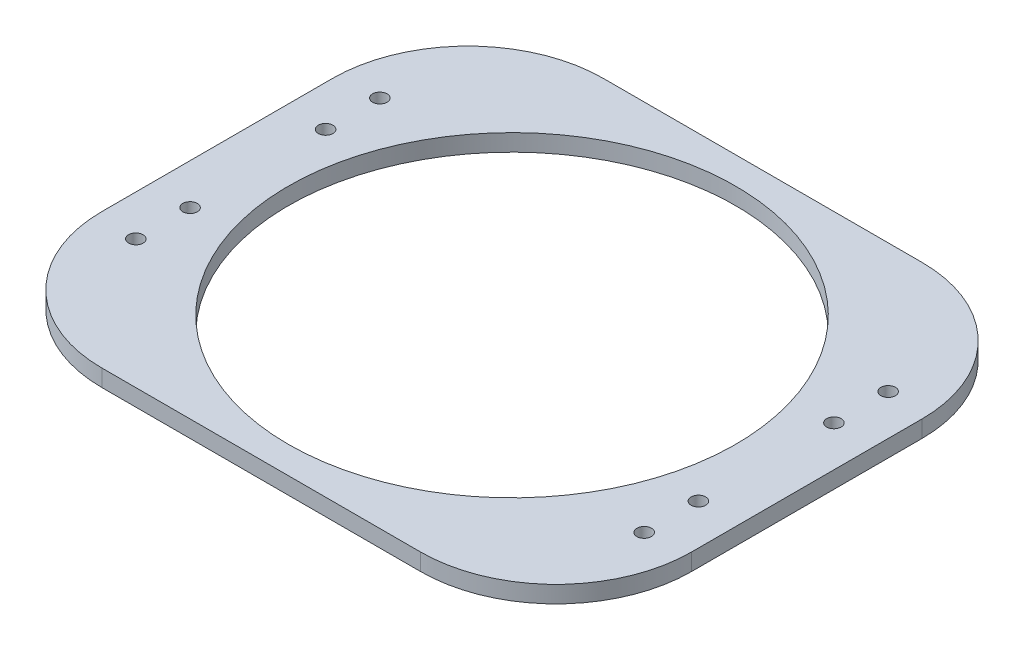
ISO-10303-21;
HEADER;
FILE_DESCRIPTION(('STEP AP214'),'2;1');
FILE_NAME('part.step','',(''),(''),'','','');
FILE_SCHEMA(('AUTOMOTIVE_DESIGN { 1 0 10303 214 1 1 1 1 }'));
ENDSEC;
DATA;
#1=APPLICATION_CONTEXT('core data for automotive mechanical design processes');
#2=APPLICATION_PROTOCOL_DEFINITION('international standard','automotive_design',2000,#1);
#3=PRODUCT_CONTEXT('',#1,'mechanical');
#4=PRODUCT('Part','Part','',(#3));
#5=PRODUCT_RELATED_PRODUCT_CATEGORY('part','',(#4));
#6=PRODUCT_DEFINITION_FORMATION('','',#4);
#7=PRODUCT_DEFINITION_CONTEXT('part definition',#1,'design');
#8=PRODUCT_DEFINITION('design','',#6,#7);
#9=PRODUCT_DEFINITION_SHAPE('','',#8);
#10=(LENGTH_UNIT() NAMED_UNIT(*) SI_UNIT(.MILLI.,.METRE.));
#11=(NAMED_UNIT(*) PLANE_ANGLE_UNIT() SI_UNIT($,.RADIAN.));
#12=(NAMED_UNIT(*) SI_UNIT($,.STERADIAN.) SOLID_ANGLE_UNIT());
#13=UNCERTAINTY_MEASURE_WITH_UNIT(LENGTH_MEASURE(1.E-05),#10,'distance_accuracy_value','');
#14=(GEOMETRIC_REPRESENTATION_CONTEXT(3) GLOBAL_UNCERTAINTY_ASSIGNED_CONTEXT((#13)) GLOBAL_UNIT_ASSIGNED_CONTEXT((#10,
#11,#12)) REPRESENTATION_CONTEXT('',''));
#15=CARTESIAN_POINT('',(0.,0.,0.));
#16=DIRECTION('',(0.,0.,1.));
#17=DIRECTION('',(1.,0.,0.));
#18=AXIS2_PLACEMENT_3D('',#15,#16,#17);
#19=CARTESIAN_POINT('',(0.,5.,0.));
#20=DIRECTION('',(0.,1.,0.));
#21=DIRECTION('',(0.,0.,1.));
#22=AXIS2_PLACEMENT_3D('',#19,#20,#21);
#23=PLANE('',#22);
#24=CARTESIAN_POINT('',(-75.,5.,-20.));
#25=DIRECTION('',(0.,1.,0.));
#26=DIRECTION('',(0.,0.,-1.));
#27=AXIS2_PLACEMENT_3D('',#24,#25,#26);
#28=CIRCLE('',#27,2.15);
#29=CARTESIAN_POINT('',(-75.,5.,-22.15));
#30=VERTEX_POINT('',#29);
#31=EDGE_CURVE('E265',#30,#30,#28,.T.);
#32=ORIENTED_EDGE('',*,*,#31,.F.);
#33=EDGE_LOOP('',(#32));
#34=FACE_BOUND('',#33,.T.);
#35=CARTESIAN_POINT('',(-75.,5.,36.));
#36=DIRECTION('',(0.,1.,0.));
#37=DIRECTION('',(0.,0.,1.));
#38=AXIS2_PLACEMENT_3D('',#35,#36,#37);
#39=CIRCLE('',#38,2.15);
#40=CARTESIAN_POINT('',(-75.,5.,38.15));
#41=VERTEX_POINT('',#40);
#42=EDGE_CURVE('E249',#41,#41,#39,.T.);
#43=ORIENTED_EDGE('',*,*,#42,.F.);
#44=EDGE_LOOP('',(#43));
#45=FACE_BOUND('',#44,.T.);
#46=CARTESIAN_POINT('',(75.,5.,20.));
#47=DIRECTION('',(0.,1.,0.));
#48=DIRECTION('',(0.,0.,-1.));
#49=AXIS2_PLACEMENT_3D('',#46,#47,#48);
#50=CIRCLE('',#49,2.15);
#51=CARTESIAN_POINT('',(75.,5.,17.85));
#52=VERTEX_POINT('',#51);
#53=EDGE_CURVE('E233',#52,#52,#50,.T.);
#54=ORIENTED_EDGE('',*,*,#53,.F.);
#55=EDGE_LOOP('',(#54));
#56=FACE_BOUND('',#55,.T.);
#57=CARTESIAN_POINT('',(75.,5.,-36.));
#58=DIRECTION('',(0.,1.,0.));
#59=DIRECTION('',(0.,0.,1.));
#60=AXIS2_PLACEMENT_3D('',#57,#58,#59);
#61=CIRCLE('',#60,2.15);
#62=CARTESIAN_POINT('',(75.,5.,-33.85));
#63=VERTEX_POINT('',#62);
#64=EDGE_CURVE('E219',#63,#63,#61,.T.);
#65=ORIENTED_EDGE('',*,*,#64,.F.);
#66=EDGE_LOOP('',(#65));
#67=FACE_BOUND('',#66,.T.);
#68=DIRECTION('',(-1.,0.,0.));
#69=VECTOR('',#68,1.);
#70=CARTESIAN_POINT('',(87.,5.,-74.));
#71=LINE('',#70,#69);
#72=CARTESIAN_POINT('',(47.,5.,-74.));
#73=VERTEX_POINT('',#72);
#74=CARTESIAN_POINT('',(-47.,5.,-74.));
#75=VERTEX_POINT('',#74);
#76=EDGE_CURVE('E154',#73,#75,#71,.T.);
#77=ORIENTED_EDGE('',*,*,#76,.T.);
#78=CARTESIAN_POINT('',(-47.,5.,-34.));
#79=DIRECTION('',(0.,1.,0.));
#80=DIRECTION('',(0.,0.,1.));
#81=AXIS2_PLACEMENT_3D('',#78,#79,#80);
#82=CIRCLE('',#81,40.);
#83=CARTESIAN_POINT('',(-87.,5.,-34.));
#84=VERTEX_POINT('',#83);
#85=EDGE_CURVE('E184',#75,#84,#82,.T.);
#86=ORIENTED_EDGE('',*,*,#85,.T.);
#87=DIRECTION('',(0.,0.,1.));
#88=VECTOR('',#87,1.);
#89=CARTESIAN_POINT('',(-87.,5.,74.));
#90=LINE('',#89,#88);
#91=CARTESIAN_POINT('',(-87.,5.,34.));
#92=VERTEX_POINT('',#91);
#93=EDGE_CURVE('E133',#84,#92,#90,.T.);
#94=ORIENTED_EDGE('',*,*,#93,.T.);
#95=CARTESIAN_POINT('',(-47.,5.,34.));
#96=DIRECTION('',(0.,1.,0.));
#97=DIRECTION('',(0.,0.,1.));
#98=AXIS2_PLACEMENT_3D('',#95,#96,#97);
#99=CIRCLE('',#98,40.);
#100=CARTESIAN_POINT('',(-47.,5.,74.));
#101=VERTEX_POINT('',#100);
#102=EDGE_CURVE('E176',#92,#101,#99,.T.);
#103=ORIENTED_EDGE('',*,*,#102,.T.);
#104=DIRECTION('',(1.,0.,0.));
#105=VECTOR('',#104,1.);
#106=CARTESIAN_POINT('',(87.,5.,74.));
#107=LINE('',#106,#105);
#108=CARTESIAN_POINT('',(47.,5.,74.));
#109=VERTEX_POINT('',#108);
#110=EDGE_CURVE('E199',#101,#109,#107,.T.);
#111=ORIENTED_EDGE('',*,*,#110,.T.);
#112=CARTESIAN_POINT('',(47.,5.,34.));
#113=DIRECTION('',(0.,1.,0.));
#114=DIRECTION('',(0.,0.,1.));
#115=AXIS2_PLACEMENT_3D('',#112,#113,#114);
#116=CIRCLE('',#115,40.);
#117=CARTESIAN_POINT('',(87.,5.,34.));
#118=VERTEX_POINT('',#117);
#119=EDGE_CURVE('E68',#109,#118,#116,.T.);
#120=ORIENTED_EDGE('',*,*,#119,.T.);
#121=DIRECTION('',(0.,0.,-1.));
#122=VECTOR('',#121,1.);
#123=CARTESIAN_POINT('',(87.,5.,74.));
#124=LINE('',#123,#122);
#125=CARTESIAN_POINT('',(87.,5.,-34.));
#126=VERTEX_POINT('',#125);
#127=EDGE_CURVE('E207',#118,#126,#124,.T.);
#128=ORIENTED_EDGE('',*,*,#127,.T.);
#129=CARTESIAN_POINT('',(47.,5.,-34.));
#130=DIRECTION('',(0.,1.,0.));
#131=DIRECTION('',(0.,0.,1.));
#132=AXIS2_PLACEMENT_3D('',#129,#130,#131);
#133=CIRCLE('',#132,40.);
#134=EDGE_CURVE('E181',#126,#73,#133,.T.);
#135=ORIENTED_EDGE('',*,*,#134,.T.);
#136=EDGE_LOOP('',(#77,#86,#94,#103,#111,#120,#128,#135));
#137=FACE_BOUND('',#136,.T.);
#138=CARTESIAN_POINT('',(0.,5.,0.));
#139=DIRECTION('',(0.,1.,0.));
#140=DIRECTION('',(0.,0.,1.));
#141=AXIS2_PLACEMENT_3D('',#138,#139,#140);
#142=CIRCLE('',#141,66.);
#143=CARTESIAN_POINT('',(0.,5.,66.));
#144=VERTEX_POINT('',#143);
#145=EDGE_CURVE('E143',#144,#144,#142,.T.);
#146=ORIENTED_EDGE('',*,*,#145,.F.);
#147=EDGE_LOOP('',(#146));
#148=FACE_BOUND('',#147,.T.);
#149=CARTESIAN_POINT('',(75.,5.,-20.));
#150=DIRECTION('',(0.,1.,0.));
#151=DIRECTION('',(0.,0.,1.));
#152=AXIS2_PLACEMENT_3D('',#149,#150,#151);
#153=CIRCLE('',#152,2.15);
#154=CARTESIAN_POINT('',(75.,5.,-17.85));
#155=VERTEX_POINT('',#154);
#156=EDGE_CURVE('E225',#155,#155,#153,.T.);
#157=ORIENTED_EDGE('',*,*,#156,.F.);
#158=EDGE_LOOP('',(#157));
#159=FACE_BOUND('',#158,.T.);
#160=CARTESIAN_POINT('',(75.,5.,36.));
#161=DIRECTION('',(0.,1.,0.));
#162=DIRECTION('',(0.,0.,-1.));
#163=AXIS2_PLACEMENT_3D('',#160,#161,#162);
#164=CIRCLE('',#163,2.15);
#165=CARTESIAN_POINT('',(75.,5.,33.85));
#166=VERTEX_POINT('',#165);
#167=EDGE_CURVE('E241',#166,#166,#164,.T.);
#168=ORIENTED_EDGE('',*,*,#167,.F.);
#169=EDGE_LOOP('',(#168));
#170=FACE_BOUND('',#169,.T.);
#171=CARTESIAN_POINT('',(-75.,5.,20.));
#172=DIRECTION('',(0.,1.,0.));
#173=DIRECTION('',(0.,0.,1.));
#174=AXIS2_PLACEMENT_3D('',#171,#172,#173);
#175=CIRCLE('',#174,2.15);
#176=CARTESIAN_POINT('',(-75.,5.,22.15));
#177=VERTEX_POINT('',#176);
#178=EDGE_CURVE('E257',#177,#177,#175,.T.);
#179=ORIENTED_EDGE('',*,*,#178,.F.);
#180=EDGE_LOOP('',(#179));
#181=FACE_BOUND('',#180,.T.);
#182=CARTESIAN_POINT('',(-75.,5.,-36.));
#183=DIRECTION('',(0.,1.,0.));
#184=DIRECTION('',(0.,0.,-1.));
#185=AXIS2_PLACEMENT_3D('',#182,#183,#184);
#186=CIRCLE('',#185,2.15);
#187=CARTESIAN_POINT('',(-75.,5.,-38.15));
#188=VERTEX_POINT('',#187);
#189=EDGE_CURVE('E273',#188,#188,#186,.T.);
#190=ORIENTED_EDGE('',*,*,#189,.F.);
#191=EDGE_LOOP('',(#190));
#192=FACE_BOUND('',#191,.T.);
#193=ADVANCED_FACE('F45',(#34,#45,#56,#67,#137,#148,#159,#170,#181,#192),#23,.T.);
#194=CARTESIAN_POINT('',(0.,0.,0.));
#195=DIRECTION('',(0.,1.,0.));
#196=DIRECTION('',(0.,0.,1.));
#197=AXIS2_PLACEMENT_3D('',#194,#195,#196);
#198=PLANE('',#197);
#199=DIRECTION('',(0.,0.,1.));
#200=VECTOR('',#199,1.);
#201=CARTESIAN_POINT('',(-87.,0.,74.));
#202=LINE('',#201,#200);
#203=CARTESIAN_POINT('',(-87.,0.,-34.));
#204=VERTEX_POINT('',#203);
#205=CARTESIAN_POINT('',(-87.,0.,34.));
#206=VERTEX_POINT('',#205);
#207=EDGE_CURVE('E130',#204,#206,#202,.T.);
#208=ORIENTED_EDGE('',*,*,#207,.F.);
#209=CARTESIAN_POINT('',(-47.,0.,-34.));
#210=DIRECTION('',(0.,1.,0.));
#211=DIRECTION('',(0.,0.,1.));
#212=AXIS2_PLACEMENT_3D('',#209,#210,#211);
#213=CIRCLE('',#212,40.);
#214=CARTESIAN_POINT('',(-47.,0.,-74.));
#215=VERTEX_POINT('',#214);
#216=EDGE_CURVE('E112',#204,#215,#213,.F.);
#217=ORIENTED_EDGE('',*,*,#216,.T.);
#218=DIRECTION('',(-1.,0.,0.));
#219=VECTOR('',#218,1.);
#220=CARTESIAN_POINT('',(87.,0.,-74.));
#221=LINE('',#220,#219);
#222=CARTESIAN_POINT('',(47.,0.,-74.));
#223=VERTEX_POINT('',#222);
#224=EDGE_CURVE('E159',#223,#215,#221,.T.);
#225=ORIENTED_EDGE('',*,*,#224,.F.);
#226=CARTESIAN_POINT('',(47.,0.,-34.));
#227=DIRECTION('',(0.,1.,0.));
#228=DIRECTION('',(0.,0.,1.));
#229=AXIS2_PLACEMENT_3D('',#226,#227,#228);
#230=CIRCLE('',#229,40.);
#231=CARTESIAN_POINT('',(87.,0.,-34.));
#232=VERTEX_POINT('',#231);
#233=EDGE_CURVE('E124',#223,#232,#230,.F.);
#234=ORIENTED_EDGE('',*,*,#233,.T.);
#235=DIRECTION('',(0.,0.,-1.));
#236=VECTOR('',#235,1.);
#237=CARTESIAN_POINT('',(87.,0.,74.));
#238=LINE('',#237,#236);
#239=CARTESIAN_POINT('',(87.,0.,34.));
#240=VERTEX_POINT('',#239);
#241=EDGE_CURVE('E148',#240,#232,#238,.T.);
#242=ORIENTED_EDGE('',*,*,#241,.F.);
#243=CARTESIAN_POINT('',(47.,0.,34.));
#244=DIRECTION('',(0.,1.,0.));
#245=DIRECTION('',(0.,0.,1.));
#246=AXIS2_PLACEMENT_3D('',#243,#244,#245);
#247=CIRCLE('',#246,40.);
#248=CARTESIAN_POINT('',(47.,0.,74.));
#249=VERTEX_POINT('',#248);
#250=EDGE_CURVE('E166',#240,#249,#247,.F.);
#251=ORIENTED_EDGE('',*,*,#250,.T.);
#252=DIRECTION('',(1.,0.,0.));
#253=VECTOR('',#252,1.);
#254=CARTESIAN_POINT('',(87.,0.,74.));
#255=LINE('',#254,#253);
#256=CARTESIAN_POINT('',(-47.,0.,74.));
#257=VERTEX_POINT('',#256);
#258=EDGE_CURVE('E142',#257,#249,#255,.T.);
#259=ORIENTED_EDGE('',*,*,#258,.F.);
#260=CARTESIAN_POINT('',(-47.,0.,34.));
#261=DIRECTION('',(0.,1.,0.));
#262=DIRECTION('',(0.,0.,1.));
#263=AXIS2_PLACEMENT_3D('',#260,#261,#262);
#264=CIRCLE('',#263,40.);
#265=EDGE_CURVE('E135',#257,#206,#264,.F.);
#266=ORIENTED_EDGE('',*,*,#265,.T.);
#267=EDGE_LOOP('',(#208,#217,#225,#234,#242,#251,#259,#266));
#268=FACE_BOUND('',#267,.T.);
#269=CARTESIAN_POINT('',(0.,0.,0.));
#270=DIRECTION('',(0.,1.,0.));
#271=DIRECTION('',(0.,0.,1.));
#272=AXIS2_PLACEMENT_3D('',#269,#270,#271);
#273=CIRCLE('',#272,66.);
#274=CARTESIAN_POINT('',(0.,0.,66.));
#275=VERTEX_POINT('',#274);
#276=EDGE_CURVE('E151',#275,#275,#273,.T.);
#277=ORIENTED_EDGE('',*,*,#276,.T.);
#278=EDGE_LOOP('',(#277));
#279=FACE_BOUND('',#278,.T.);
#280=CARTESIAN_POINT('',(75.,0.,-36.));
#281=DIRECTION('',(0.,1.,0.));
#282=DIRECTION('',(0.,0.,1.));
#283=AXIS2_PLACEMENT_3D('',#280,#281,#282);
#284=CIRCLE('',#283,2.15);
#285=CARTESIAN_POINT('',(75.,0.,-33.85));
#286=VERTEX_POINT('',#285);
#287=EDGE_CURVE('E221',#286,#286,#284,.T.);
#288=ORIENTED_EDGE('',*,*,#287,.T.);
#289=EDGE_LOOP('',(#288));
#290=FACE_BOUND('',#289,.T.);
#291=CARTESIAN_POINT('',(75.,0.,-20.));
#292=DIRECTION('',(0.,1.,0.));
#293=DIRECTION('',(0.,0.,1.));
#294=AXIS2_PLACEMENT_3D('',#291,#292,#293);
#295=CIRCLE('',#294,2.15);
#296=CARTESIAN_POINT('',(75.,0.,-17.85));
#297=VERTEX_POINT('',#296);
#298=EDGE_CURVE('E229',#297,#297,#295,.T.);
#299=ORIENTED_EDGE('',*,*,#298,.T.);
#300=EDGE_LOOP('',(#299));
#301=FACE_BOUND('',#300,.T.);
#302=CARTESIAN_POINT('',(75.,0.,20.));
#303=DIRECTION('',(0.,1.,0.));
#304=DIRECTION('',(0.,0.,-1.));
#305=AXIS2_PLACEMENT_3D('',#302,#303,#304);
#306=CIRCLE('',#305,2.15);
#307=CARTESIAN_POINT('',(75.,0.,17.85));
#308=VERTEX_POINT('',#307);
#309=EDGE_CURVE('E237',#308,#308,#306,.T.);
#310=ORIENTED_EDGE('',*,*,#309,.T.);
#311=EDGE_LOOP('',(#310));
#312=FACE_BOUND('',#311,.T.);
#313=CARTESIAN_POINT('',(75.,0.,36.));
#314=DIRECTION('',(0.,1.,0.));
#315=DIRECTION('',(0.,0.,-1.));
#316=AXIS2_PLACEMENT_3D('',#313,#314,#315);
#317=CIRCLE('',#316,2.15);
#318=CARTESIAN_POINT('',(75.,0.,33.85));
#319=VERTEX_POINT('',#318);
#320=EDGE_CURVE('E245',#319,#319,#317,.T.);
#321=ORIENTED_EDGE('',*,*,#320,.T.);
#322=EDGE_LOOP('',(#321));
#323=FACE_BOUND('',#322,.T.);
#324=CARTESIAN_POINT('',(-75.,0.,36.));
#325=DIRECTION('',(0.,1.,0.));
#326=DIRECTION('',(0.,0.,1.));
#327=AXIS2_PLACEMENT_3D('',#324,#325,#326);
#328=CIRCLE('',#327,2.15);
#329=CARTESIAN_POINT('',(-75.,0.,38.15));
#330=VERTEX_POINT('',#329);
#331=EDGE_CURVE('E253',#330,#330,#328,.T.);
#332=ORIENTED_EDGE('',*,*,#331,.T.);
#333=EDGE_LOOP('',(#332));
#334=FACE_BOUND('',#333,.T.);
#335=CARTESIAN_POINT('',(-75.,0.,20.));
#336=DIRECTION('',(0.,1.,0.));
#337=DIRECTION('',(0.,0.,1.));
#338=AXIS2_PLACEMENT_3D('',#335,#336,#337);
#339=CIRCLE('',#338,2.15);
#340=CARTESIAN_POINT('',(-75.,0.,22.15));
#341=VERTEX_POINT('',#340);
#342=EDGE_CURVE('E261',#341,#341,#339,.T.);
#343=ORIENTED_EDGE('',*,*,#342,.T.);
#344=EDGE_LOOP('',(#343));
#345=FACE_BOUND('',#344,.T.);
#346=CARTESIAN_POINT('',(-75.,0.,-20.));
#347=DIRECTION('',(0.,1.,0.));
#348=DIRECTION('',(0.,0.,-1.));
#349=AXIS2_PLACEMENT_3D('',#346,#347,#348);
#350=CIRCLE('',#349,2.15);
#351=CARTESIAN_POINT('',(-75.,0.,-22.15));
#352=VERTEX_POINT('',#351);
#353=EDGE_CURVE('E269',#352,#352,#350,.T.);
#354=ORIENTED_EDGE('',*,*,#353,.T.);
#355=EDGE_LOOP('',(#354));
#356=FACE_BOUND('',#355,.T.);
#357=CARTESIAN_POINT('',(-75.,0.,-36.));
#358=DIRECTION('',(0.,1.,0.));
#359=DIRECTION('',(0.,0.,-1.));
#360=AXIS2_PLACEMENT_3D('',#357,#358,#359);
#361=CIRCLE('',#360,2.15);
#362=CARTESIAN_POINT('',(-75.,0.,-38.15));
#363=VERTEX_POINT('',#362);
#364=EDGE_CURVE('E277',#363,#363,#361,.T.);
#365=ORIENTED_EDGE('',*,*,#364,.T.);
#366=EDGE_LOOP('',(#365));
#367=FACE_BOUND('',#366,.T.);
#368=ADVANCED_FACE('F138',(#268,#279,#290,#301,#312,#323,#334,#345,#356,#367),#198,.F.);
#369=CARTESIAN_POINT('',(-87.,5.,74.));
#370=DIRECTION('',(1.,0.,0.));
#371=DIRECTION('',(0.,0.,-1.));
#372=AXIS2_PLACEMENT_3D('',#369,#370,#371);
#373=PLANE('',#372);
#374=ORIENTED_EDGE('',*,*,#93,.F.);
#375=DIRECTION('',(0.,-1.,0.));
#376=VECTOR('',#375,1.);
#377=CARTESIAN_POINT('',(-87.,5.,-34.));
#378=LINE('',#377,#376);
#379=EDGE_CURVE('E116',#84,#204,#378,.T.);
#380=ORIENTED_EDGE('',*,*,#379,.T.);
#381=ORIENTED_EDGE('',*,*,#207,.T.);
#382=DIRECTION('',(0.,-1.,0.));
#383=VECTOR('',#382,1.);
#384=CARTESIAN_POINT('',(-87.,5.,34.));
#385=LINE('',#384,#383);
#386=EDGE_CURVE('E136',#206,#92,#385,.F.);
#387=ORIENTED_EDGE('',*,*,#386,.T.);
#388=EDGE_LOOP('',(#374,#380,#381,#387));
#389=FACE_BOUND('',#388,.T.);
#390=ADVANCED_FACE('F129',(#389),#373,.F.);
#391=CARTESIAN_POINT('',(87.,5.,74.));
#392=DIRECTION('',(0.,0.,-1.));
#393=DIRECTION('',(-1.,0.,0.));
#394=AXIS2_PLACEMENT_3D('',#391,#392,#393);
#395=PLANE('',#394);
#396=ORIENTED_EDGE('',*,*,#258,.T.);
#397=DIRECTION('',(0.,-1.,0.));
#398=VECTOR('',#397,1.);
#399=CARTESIAN_POINT('',(47.,5.,74.));
#400=LINE('',#399,#398);
#401=EDGE_CURVE('E11',#249,#109,#400,.F.);
#402=ORIENTED_EDGE('',*,*,#401,.T.);
#403=ORIENTED_EDGE('',*,*,#110,.F.);
#404=DIRECTION('',(0.,-1.,0.));
#405=VECTOR('',#404,1.);
#406=CARTESIAN_POINT('',(-47.,5.,74.));
#407=LINE('',#406,#405);
#408=EDGE_CURVE('E54',#101,#257,#407,.T.);
#409=ORIENTED_EDGE('',*,*,#408,.T.);
#410=EDGE_LOOP('',(#396,#402,#403,#409));
#411=FACE_BOUND('',#410,.T.);
#412=ADVANCED_FACE('F197',(#411),#395,.F.);
#413=CARTESIAN_POINT('',(87.,5.,74.));
#414=DIRECTION('',(-1.,0.,0.));
#415=DIRECTION('',(0.,0.,1.));
#416=AXIS2_PLACEMENT_3D('',#413,#414,#415);
#417=PLANE('',#416);
#418=ORIENTED_EDGE('',*,*,#241,.T.);
#419=DIRECTION('',(0.,-1.,0.));
#420=VECTOR('',#419,1.);
#421=CARTESIAN_POINT('',(87.,5.,-34.));
#422=LINE('',#421,#420);
#423=EDGE_CURVE('E61',#232,#126,#422,.F.);
#424=ORIENTED_EDGE('',*,*,#423,.T.);
#425=ORIENTED_EDGE('',*,*,#127,.F.);
#426=DIRECTION('',(0.,-1.,0.));
#427=VECTOR('',#426,1.);
#428=CARTESIAN_POINT('',(87.,5.,34.));
#429=LINE('',#428,#427);
#430=EDGE_CURVE('E187',#118,#240,#429,.T.);
#431=ORIENTED_EDGE('',*,*,#430,.T.);
#432=EDGE_LOOP('',(#418,#424,#425,#431));
#433=FACE_BOUND('',#432,.T.);
#434=ADVANCED_FACE('F206',(#433),#417,.F.);
#435=CARTESIAN_POINT('',(87.,5.,-74.));
#436=DIRECTION('',(0.,0.,1.));
#437=DIRECTION('',(1.,0.,0.));
#438=AXIS2_PLACEMENT_3D('',#435,#436,#437);
#439=PLANE('',#438);
#440=ORIENTED_EDGE('',*,*,#224,.T.);
#441=DIRECTION('',(0.,-1.,0.));
#442=VECTOR('',#441,1.);
#443=CARTESIAN_POINT('',(-47.,5.,-74.));
#444=LINE('',#443,#442);
#445=EDGE_CURVE('E117',#215,#75,#444,.F.);
#446=ORIENTED_EDGE('',*,*,#445,.T.);
#447=ORIENTED_EDGE('',*,*,#76,.F.);
#448=DIRECTION('',(0.,-1.,0.));
#449=VECTOR('',#448,1.);
#450=CARTESIAN_POINT('',(47.,5.,-74.));
#451=LINE('',#450,#449);
#452=EDGE_CURVE('E123',#73,#223,#451,.T.);
#453=ORIENTED_EDGE('',*,*,#452,.T.);
#454=EDGE_LOOP('',(#440,#446,#447,#453));
#455=FACE_BOUND('',#454,.T.);
#456=ADVANCED_FACE('F302',(#455),#439,.F.);
#457=CARTESIAN_POINT('',(0.,5.,0.));
#458=DIRECTION('',(0.,-1.,0.));
#459=DIRECTION('',(0.,0.,-1.));
#460=AXIS2_PLACEMENT_3D('',#457,#458,#459);
#461=CYLINDRICAL_SURFACE('',#460,66.);
#462=ORIENTED_EDGE('',*,*,#145,.T.);
#463=EDGE_LOOP('',(#462));
#464=FACE_BOUND('',#463,.T.);
#465=ORIENTED_EDGE('',*,*,#276,.F.);
#466=EDGE_LOOP('',(#465));
#467=FACE_BOUND('',#466,.T.);
#468=ADVANCED_FACE('F299',(#464,#467),#461,.F.);
#469=CARTESIAN_POINT('',(75.,5.,-36.));
#470=DIRECTION('',(0.,-1.,0.));
#471=DIRECTION('',(0.,0.,-1.));
#472=AXIS2_PLACEMENT_3D('',#469,#470,#471);
#473=CYLINDRICAL_SURFACE('',#472,2.15);
#474=ORIENTED_EDGE('',*,*,#64,.T.);
#475=EDGE_LOOP('',(#474));
#476=FACE_BOUND('',#475,.T.);
#477=ORIENTED_EDGE('',*,*,#287,.F.);
#478=EDGE_LOOP('',(#477));
#479=FACE_BOUND('',#478,.T.);
#480=ADVANCED_FACE('F366',(#476,#479),#473,.F.);
#481=CARTESIAN_POINT('',(75.,5.,-20.));
#482=DIRECTION('',(0.,-1.,0.));
#483=DIRECTION('',(0.,0.,-1.));
#484=AXIS2_PLACEMENT_3D('',#481,#482,#483);
#485=CYLINDRICAL_SURFACE('',#484,2.15);
#486=ORIENTED_EDGE('',*,*,#156,.T.);
#487=EDGE_LOOP('',(#486));
#488=FACE_BOUND('',#487,.T.);
#489=ORIENTED_EDGE('',*,*,#298,.F.);
#490=EDGE_LOOP('',(#489));
#491=FACE_BOUND('',#490,.T.);
#492=ADVANCED_FACE('F363',(#488,#491),#485,.F.);
#493=CARTESIAN_POINT('',(75.,5.,20.));
#494=DIRECTION('',(0.,-1.,0.));
#495=DIRECTION('',(0.,0.,-1.));
#496=AXIS2_PLACEMENT_3D('',#493,#494,#495);
#497=CYLINDRICAL_SURFACE('',#496,2.15);
#498=ORIENTED_EDGE('',*,*,#53,.T.);
#499=EDGE_LOOP('',(#498));
#500=FACE_BOUND('',#499,.T.);
#501=ORIENTED_EDGE('',*,*,#309,.F.);
#502=EDGE_LOOP('',(#501));
#503=FACE_BOUND('',#502,.T.);
#504=ADVANCED_FACE('F359',(#500,#503),#497,.F.);
#505=CARTESIAN_POINT('',(75.,5.,36.));
#506=DIRECTION('',(0.,-1.,0.));
#507=DIRECTION('',(0.,0.,-1.));
#508=AXIS2_PLACEMENT_3D('',#505,#506,#507);
#509=CYLINDRICAL_SURFACE('',#508,2.15);
#510=ORIENTED_EDGE('',*,*,#167,.T.);
#511=EDGE_LOOP('',(#510));
#512=FACE_BOUND('',#511,.T.);
#513=ORIENTED_EDGE('',*,*,#320,.F.);
#514=EDGE_LOOP('',(#513));
#515=FACE_BOUND('',#514,.T.);
#516=ADVANCED_FACE('F355',(#512,#515),#509,.F.);
#517=CARTESIAN_POINT('',(-75.,5.,36.));
#518=DIRECTION('',(0.,-1.,0.));
#519=DIRECTION('',(0.,0.,-1.));
#520=AXIS2_PLACEMENT_3D('',#517,#518,#519);
#521=CYLINDRICAL_SURFACE('',#520,2.15);
#522=ORIENTED_EDGE('',*,*,#42,.T.);
#523=EDGE_LOOP('',(#522));
#524=FACE_BOUND('',#523,.T.);
#525=ORIENTED_EDGE('',*,*,#331,.F.);
#526=EDGE_LOOP('',(#525));
#527=FACE_BOUND('',#526,.T.);
#528=ADVANCED_FACE('F338',(#524,#527),#521,.F.);
#529=CARTESIAN_POINT('',(-75.,5.,20.));
#530=DIRECTION('',(0.,-1.,0.));
#531=DIRECTION('',(0.,0.,-1.));
#532=AXIS2_PLACEMENT_3D('',#529,#530,#531);
#533=CYLINDRICAL_SURFACE('',#532,2.15);
#534=ORIENTED_EDGE('',*,*,#178,.T.);
#535=EDGE_LOOP('',(#534));
#536=FACE_BOUND('',#535,.T.);
#537=ORIENTED_EDGE('',*,*,#342,.F.);
#538=EDGE_LOOP('',(#537));
#539=FACE_BOUND('',#538,.T.);
#540=ADVANCED_FACE('F334',(#536,#539),#533,.F.);
#541=CARTESIAN_POINT('',(-75.,5.,-20.));
#542=DIRECTION('',(0.,-1.,0.));
#543=DIRECTION('',(0.,0.,-1.));
#544=AXIS2_PLACEMENT_3D('',#541,#542,#543);
#545=CYLINDRICAL_SURFACE('',#544,2.15);
#546=ORIENTED_EDGE('',*,*,#31,.T.);
#547=EDGE_LOOP('',(#546));
#548=FACE_BOUND('',#547,.T.);
#549=ORIENTED_EDGE('',*,*,#353,.F.);
#550=EDGE_LOOP('',(#549));
#551=FACE_BOUND('',#550,.T.);
#552=ADVANCED_FACE('F337',(#548,#551),#545,.F.);
#553=CARTESIAN_POINT('',(-75.,5.,-36.));
#554=DIRECTION('',(0.,-1.,0.));
#555=DIRECTION('',(0.,0.,-1.));
#556=AXIS2_PLACEMENT_3D('',#553,#554,#555);
#557=CYLINDRICAL_SURFACE('',#556,2.15);
#558=ORIENTED_EDGE('',*,*,#189,.T.);
#559=EDGE_LOOP('',(#558));
#560=FACE_BOUND('',#559,.T.);
#561=ORIENTED_EDGE('',*,*,#364,.F.);
#562=EDGE_LOOP('',(#561));
#563=FACE_BOUND('',#562,.T.);
#564=ADVANCED_FACE('F285',(#560,#563),#557,.F.);
#565=CARTESIAN_POINT('',(-47.,5.,-34.));
#566=DIRECTION('',(0.,-1.,0.));
#567=DIRECTION('',(0.,0.,-1.));
#568=AXIS2_PLACEMENT_3D('',#565,#566,#567);
#569=CYLINDRICAL_SURFACE('',#568,40.);
#570=ORIENTED_EDGE('',*,*,#85,.F.);
#571=ORIENTED_EDGE('',*,*,#445,.F.);
#572=ORIENTED_EDGE('',*,*,#216,.F.);
#573=ORIENTED_EDGE('',*,*,#379,.F.);
#574=EDGE_LOOP('',(#570,#571,#572,#573));
#575=FACE_BOUND('',#574,.T.);
#576=ADVANCED_FACE('F115',(#575),#569,.T.);
#577=CARTESIAN_POINT('',(47.,5.,-34.));
#578=DIRECTION('',(0.,-1.,0.));
#579=DIRECTION('',(0.,0.,-1.));
#580=AXIS2_PLACEMENT_3D('',#577,#578,#579);
#581=CYLINDRICAL_SURFACE('',#580,40.);
#582=ORIENTED_EDGE('',*,*,#134,.F.);
#583=ORIENTED_EDGE('',*,*,#423,.F.);
#584=ORIENTED_EDGE('',*,*,#233,.F.);
#585=ORIENTED_EDGE('',*,*,#452,.F.);
#586=EDGE_LOOP('',(#582,#583,#584,#585));
#587=FACE_BOUND('',#586,.T.);
#588=ADVANCED_FACE('F314',(#587),#581,.T.);
#589=CARTESIAN_POINT('',(47.,5.,34.));
#590=DIRECTION('',(0.,-1.,0.));
#591=DIRECTION('',(0.,0.,-1.));
#592=AXIS2_PLACEMENT_3D('',#589,#590,#591);
#593=CYLINDRICAL_SURFACE('',#592,40.);
#594=ORIENTED_EDGE('',*,*,#119,.F.);
#595=ORIENTED_EDGE('',*,*,#401,.F.);
#596=ORIENTED_EDGE('',*,*,#250,.F.);
#597=ORIENTED_EDGE('',*,*,#430,.F.);
#598=EDGE_LOOP('',(#594,#595,#596,#597));
#599=FACE_BOUND('',#598,.T.);
#600=ADVANCED_FACE('F205',(#599),#593,.T.);
#601=CARTESIAN_POINT('',(-47.,5.,34.));
#602=DIRECTION('',(0.,-1.,0.));
#603=DIRECTION('',(0.,0.,-1.));
#604=AXIS2_PLACEMENT_3D('',#601,#602,#603);
#605=CYLINDRICAL_SURFACE('',#604,40.);
#606=ORIENTED_EDGE('',*,*,#102,.F.);
#607=ORIENTED_EDGE('',*,*,#386,.F.);
#608=ORIENTED_EDGE('',*,*,#265,.F.);
#609=ORIENTED_EDGE('',*,*,#408,.F.);
#610=EDGE_LOOP('',(#606,#607,#608,#609));
#611=FACE_BOUND('',#610,.T.);
#612=ADVANCED_FACE('F47',(#611),#605,.T.);
#613=CLOSED_SHELL('',(#193,#368,#390,#412,#434,#456,#468,#480,#492,#504,#516,#528,#540,#552,
#564,#576,#588,#600,#612));
#614=MANIFOLD_SOLID_BREP('B2',#613);
#615=ADVANCED_BREP_SHAPE_REPRESENTATION('',(#18,#614),#14);
#616=SHAPE_DEFINITION_REPRESENTATION(#9,#615);
ENDSEC;
END-ISO-10303-21;
